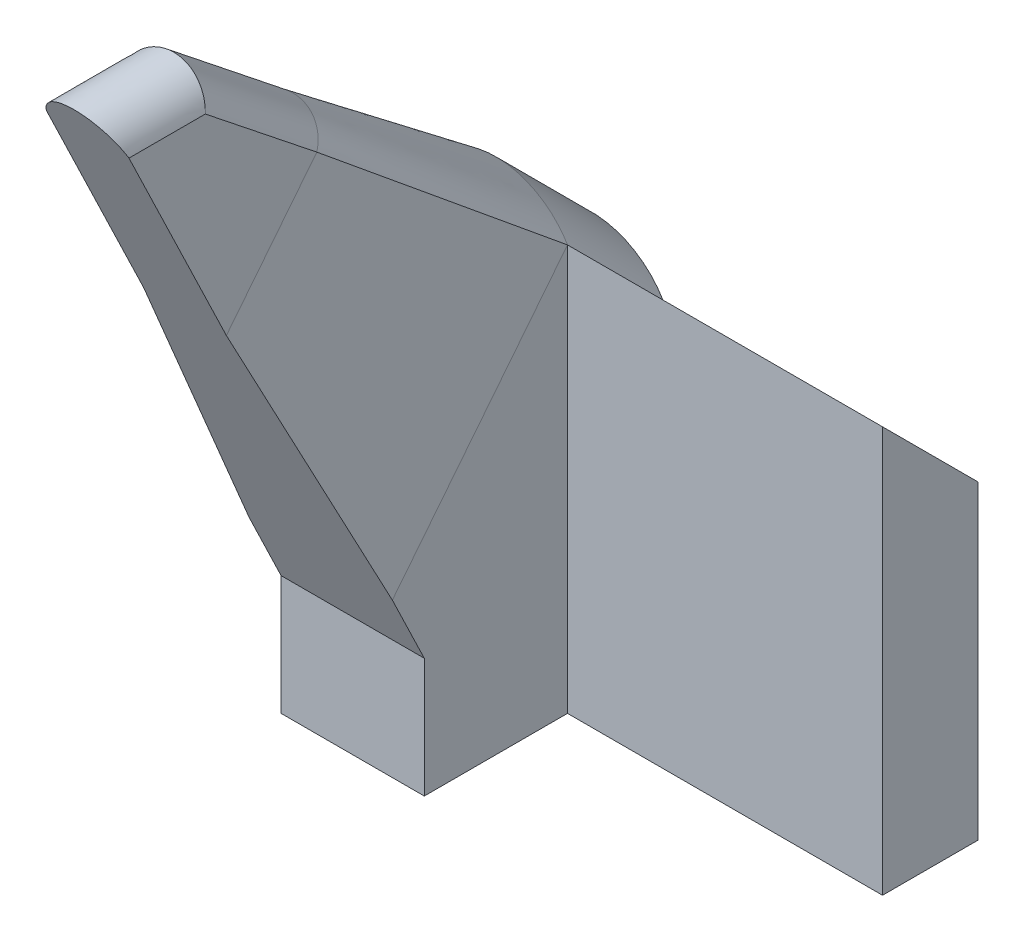
ISO-10303-21;
HEADER;
FILE_DESCRIPTION(('STEP AP214'),'2;1');
FILE_NAME('part.step','',(''),(''),'','','');
FILE_SCHEMA(('AUTOMOTIVE_DESIGN { 1 0 10303 214 1 1 1 1 }'));
ENDSEC;
DATA;
#1=APPLICATION_CONTEXT('core data for automotive mechanical design processes');
#2=APPLICATION_PROTOCOL_DEFINITION('international standard','automotive_design',2000,#1);
#3=PRODUCT_CONTEXT('',#1,'mechanical');
#4=PRODUCT('Part','Part','',(#3));
#5=PRODUCT_RELATED_PRODUCT_CATEGORY('part','',(#4));
#6=PRODUCT_DEFINITION_FORMATION('','',#4);
#7=PRODUCT_DEFINITION_CONTEXT('part definition',#1,'design');
#8=PRODUCT_DEFINITION('design','',#6,#7);
#9=PRODUCT_DEFINITION_SHAPE('','',#8);
#10=(LENGTH_UNIT() NAMED_UNIT(*) SI_UNIT(.MILLI.,.METRE.));
#11=(NAMED_UNIT(*) PLANE_ANGLE_UNIT() SI_UNIT($,.RADIAN.));
#12=(NAMED_UNIT(*) SI_UNIT($,.STERADIAN.) SOLID_ANGLE_UNIT());
#13=UNCERTAINTY_MEASURE_WITH_UNIT(LENGTH_MEASURE(1.E-05),#10,'distance_accuracy_value','');
#14=(GEOMETRIC_REPRESENTATION_CONTEXT(3) GLOBAL_UNCERTAINTY_ASSIGNED_CONTEXT((#13)) GLOBAL_UNIT_ASSIGNED_CONTEXT((#10,
#11,#12)) REPRESENTATION_CONTEXT('',''));
#15=CARTESIAN_POINT('',(0.,0.,0.));
#16=DIRECTION('',(0.,0.,1.));
#17=DIRECTION('',(1.,0.,0.));
#18=AXIS2_PLACEMENT_3D('',#15,#16,#17);
#19=CARTESIAN_POINT('',(9.6,0.751999000000001,0.));
#20=DIRECTION('',(0.,-0.707106781186548,0.707106781186547));
#21=DIRECTION('',(0.,-0.707106781186547,-0.707106781186548));
#22=AXIS2_PLACEMENT_3D('',#19,#20,#21);
#23=PLANE('',#22);
#24=DIRECTION('',(0.,-0.707106781186547,-0.707106781186548));
#25=VECTOR('',#24,1.);
#26=CARTESIAN_POINT('',(3.,2.751999,2.));
#27=LINE('',#26,#25);
#28=CARTESIAN_POINT('',(3.,2.751999,2.));
#29=VERTEX_POINT('',#28);
#30=CARTESIAN_POINT('',(3.,0.751999000000001,0.));
#31=VERTEX_POINT('',#30);
#32=EDGE_CURVE('E148',#29,#31,#27,.T.);
#33=ORIENTED_EDGE('',*,*,#32,.F.);
#34=DIRECTION('',(-1.,0.,0.));
#35=VECTOR('',#34,1.);
#36=CARTESIAN_POINT('',(9.6,2.751999,2.));
#37=LINE('',#36,#35);
#38=CARTESIAN_POINT('',(9.6,2.751999,2.));
#39=VERTEX_POINT('',#38);
#40=EDGE_CURVE('E166',#39,#29,#37,.T.);
#41=ORIENTED_EDGE('',*,*,#40,.F.);
#42=DIRECTION('',(0.,0.707106781186547,0.707106781186548));
#43=VECTOR('',#42,1.);
#44=CARTESIAN_POINT('',(9.6,0.751999000000001,0.));
#45=LINE('',#44,#43);
#46=CARTESIAN_POINT('',(9.6,0.751999000000001,0.));
#47=VERTEX_POINT('',#46);
#48=EDGE_CURVE('E254',#47,#39,#45,.T.);
#49=ORIENTED_EDGE('',*,*,#48,.F.);
#50=DIRECTION('',(-1.,0.,0.));
#51=VECTOR('',#50,1.);
#52=CARTESIAN_POINT('',(9.6,0.751999000000001,0.));
#53=LINE('',#52,#51);
#54=EDGE_CURVE('E169',#47,#31,#53,.T.);
#55=ORIENTED_EDGE('',*,*,#54,.T.);
#56=EDGE_LOOP('',(#33,#41,#49,#55));
#57=FACE_BOUND('',#56,.T.);
#58=ADVANCED_FACE('F36',(#57),#23,.F.);
#59=CARTESIAN_POINT('',(9.6,-3.248001,0.));
#60=DIRECTION('',(0.,0.,1.));
#61=DIRECTION('',(1.,0.,0.));
#62=AXIS2_PLACEMENT_3D('',#59,#60,#61);
#63=PLANE('',#62);
#64=DIRECTION('',(0.,1.,0.));
#65=VECTOR('',#64,1.);
#66=CARTESIAN_POINT('',(9.6,-3.248001,0.));
#67=LINE('',#66,#65);
#68=CARTESIAN_POINT('',(9.6,-5.748001,0.));
#69=VERTEX_POINT('',#68);
#70=EDGE_CURVE('E83',#69,#47,#67,.T.);
#71=ORIENTED_EDGE('',*,*,#70,.F.);
#72=DIRECTION('',(1.,0.,0.));
#73=VECTOR('',#72,1.);
#74=CARTESIAN_POINT('',(0.,-5.748001,0.));
#75=LINE('',#74,#73);
#76=CARTESIAN_POINT('',(0.,-5.748001,0.));
#77=VERTEX_POINT('',#76);
#78=EDGE_CURVE('E142',#77,#69,#75,.T.);
#79=ORIENTED_EDGE('',*,*,#78,.F.);
#80=DIRECTION('',(0.,1.,0.));
#81=VECTOR('',#80,1.);
#82=CARTESIAN_POINT('',(0.,-3.248001,0.));
#83=LINE('',#82,#81);
#84=CARTESIAN_POINT('',(0.,0.751999000000001,0.));
#85=VERTEX_POINT('',#84);
#86=EDGE_CURVE('E133',#77,#85,#83,.T.);
#87=ORIENTED_EDGE('',*,*,#86,.T.);
#88=CARTESIAN_POINT('',(1.5,-0.146530411764704,0.));
#89=DIRECTION('',(0.,0.,-1.));
#90=DIRECTION('',(1.,0.,0.));
#91=AXIS2_PLACEMENT_3D('',#88,#89,#90);
#92=CIRCLE('',#91,1.74852941176471);
#93=EDGE_CURVE('E141',#85,#31,#92,.T.);
#94=ORIENTED_EDGE('',*,*,#93,.T.);
#95=ORIENTED_EDGE('',*,*,#54,.F.);
#96=EDGE_LOOP('',(#71,#79,#87,#94,#95));
#97=FACE_BOUND('',#96,.T.);
#98=ADVANCED_FACE('F38',(#97),#63,.F.);
#99=CARTESIAN_POINT('',(9.6,2.751999,2.));
#100=DIRECTION('',(0.,0.,-1.));
#101=DIRECTION('',(0.,1.,0.));
#102=AXIS2_PLACEMENT_3D('',#99,#100,#101);
#103=PLANE('',#102);
#104=ORIENTED_EDGE('',*,*,#40,.T.);
#105=DIRECTION('',(0.,-1.,0.));
#106=VECTOR('',#105,1.);
#107=CARTESIAN_POINT('',(3.,2.751999,2.));
#108=LINE('',#107,#106);
#109=CARTESIAN_POINT('',(3.,-5.748001,2.));
#110=VERTEX_POINT('',#109);
#111=EDGE_CURVE('E143',#29,#110,#108,.T.);
#112=ORIENTED_EDGE('',*,*,#111,.T.);
#113=DIRECTION('',(-1.,0.,0.));
#114=VECTOR('',#113,1.);
#115=CARTESIAN_POINT('',(9.6,-5.748001,2.));
#116=LINE('',#115,#114);
#117=CARTESIAN_POINT('',(9.6,-5.748001,2.));
#118=VERTEX_POINT('',#117);
#119=EDGE_CURVE('E348',#118,#110,#116,.T.);
#120=ORIENTED_EDGE('',*,*,#119,.F.);
#121=DIRECTION('',(0.,-1.,0.));
#122=VECTOR('',#121,1.);
#123=CARTESIAN_POINT('',(9.6,2.751999,2.));
#124=LINE('',#123,#122);
#125=EDGE_CURVE('E170',#39,#118,#124,.T.);
#126=ORIENTED_EDGE('',*,*,#125,.F.);
#127=EDGE_LOOP('',(#104,#112,#120,#126));
#128=FACE_BOUND('',#127,.T.);
#129=ADVANCED_FACE('F317',(#128),#103,.F.);
#130=CARTESIAN_POINT('',(9.6,0.,0.));
#131=DIRECTION('',(-1.,0.,0.));
#132=DIRECTION('',(0.,0.,1.));
#133=AXIS2_PLACEMENT_3D('',#130,#131,#132);
#134=PLANE('',#133);
#135=ORIENTED_EDGE('',*,*,#70,.T.);
#136=ORIENTED_EDGE('',*,*,#48,.T.);
#137=ORIENTED_EDGE('',*,*,#125,.T.);
#138=DIRECTION('',(0.,0.,1.));
#139=VECTOR('',#138,1.);
#140=CARTESIAN_POINT('',(9.6,-5.748001,0.));
#141=LINE('',#140,#139);
#142=EDGE_CURVE('E352',#69,#118,#141,.T.);
#143=ORIENTED_EDGE('',*,*,#142,.F.);
#144=EDGE_LOOP('',(#135,#136,#137,#143));
#145=FACE_BOUND('',#144,.T.);
#146=ADVANCED_FACE('F314',(#145),#134,.F.);
#147=CARTESIAN_POINT('',(0.,0.,0.));
#148=DIRECTION('',(-1.,0.,0.));
#149=DIRECTION('',(0.,0.,1.));
#150=AXIS2_PLACEMENT_3D('',#147,#148,#149);
#151=PLANE('',#150);
#152=DIRECTION('',(0.,0.782438657573284,-0.622727666909795));
#153=VECTOR('',#152,1.);
#154=CARTESIAN_POINT('',(0.,-5.08829292882305,8.23993542940507));
#155=LINE('',#154,#153);
#156=CARTESIAN_POINT('',(0.,-1.85812330899022,5.66910643008125));
#157=VERTEX_POINT('',#156);
#158=CARTESIAN_POINT('',(0.,2.751999,2.));
#159=VERTEX_POINT('',#158);
#160=EDGE_CURVE('E136',#157,#159,#155,.T.);
#161=ORIENTED_EDGE('',*,*,#160,.T.);
#162=DIRECTION('',(0.,0.707106781186547,0.707106781186548));
#163=VECTOR('',#162,1.);
#164=CARTESIAN_POINT('',(0.,0.751999000000001,0.));
#165=LINE('',#164,#163);
#166=EDGE_CURVE('E129',#85,#159,#165,.T.);
#167=ORIENTED_EDGE('',*,*,#166,.F.);
#168=ORIENTED_EDGE('',*,*,#86,.F.);
#169=DIRECTION('',(0.,0.,-1.));
#170=VECTOR('',#169,1.);
#171=CARTESIAN_POINT('',(0.,-5.748001,5.));
#172=LINE('',#171,#170);
#173=CARTESIAN_POINT('',(0.,-5.748001,5.));
#174=VERTEX_POINT('',#173);
#175=EDGE_CURVE('E350',#174,#77,#172,.T.);
#176=ORIENTED_EDGE('',*,*,#175,.F.);
#177=DIRECTION('',(0.,1.,0.));
#178=VECTOR('',#177,1.);
#179=CARTESIAN_POINT('',(0.,-5.748001,5.));
#180=LINE('',#179,#178);
#181=CARTESIAN_POINT('',(0.,-3.248001,5.));
#182=VERTEX_POINT('',#181);
#183=EDGE_CURVE('E151',#174,#182,#180,.T.);
#184=ORIENTED_EDGE('',*,*,#183,.T.);
#185=DIRECTION('',(0.,-0.901025471872542,-0.433766180144167));
#186=VECTOR('',#185,1.);
#187=CARTESIAN_POINT('',(0.,8.28512503996854,10.5522071058453));
#188=LINE('',#187,#186);
#189=EDGE_CURVE('E249',#157,#182,#188,.T.);
#190=ORIENTED_EDGE('',*,*,#189,.F.);
#191=EDGE_LOOP('',(#161,#167,#168,#176,#184,#190));
#192=FACE_BOUND('',#191,.T.);
#193=ADVANCED_FACE('F131',(#192),#151,.T.);
#194=CARTESIAN_POINT('',(3.,0.,0.));
#195=DIRECTION('',(1.,0.,0.));
#196=DIRECTION('',(0.,0.,-1.));
#197=AXIS2_PLACEMENT_3D('',#194,#195,#196);
#198=PLANE('',#197);
#199=DIRECTION('',(0.,0.782438657573284,-0.622727666909795));
#200=VECTOR('',#199,1.);
#201=CARTESIAN_POINT('',(3.,-5.08829292882305,8.23993542940507));
#202=LINE('',#201,#200);
#203=CARTESIAN_POINT('',(3.,-1.85812330899022,5.66910643008125));
#204=VERTEX_POINT('',#203);
#205=EDGE_CURVE('E162',#204,#29,#202,.T.);
#206=ORIENTED_EDGE('',*,*,#205,.F.);
#207=DIRECTION('',(0.,-0.901025471872542,-0.433766180144167));
#208=VECTOR('',#207,1.);
#209=CARTESIAN_POINT('',(3.,8.28512503996854,10.5522071058453));
#210=LINE('',#209,#208);
#211=CARTESIAN_POINT('',(3.,-3.248001,5.));
#212=VERTEX_POINT('',#211);
#213=EDGE_CURVE('E241',#204,#212,#210,.T.);
#214=ORIENTED_EDGE('',*,*,#213,.T.);
#215=DIRECTION('',(0.,1.,0.));
#216=VECTOR('',#215,1.);
#217=CARTESIAN_POINT('',(3.,-5.748001,5.));
#218=LINE('',#217,#216);
#219=CARTESIAN_POINT('',(3.,-5.748001,5.));
#220=VERTEX_POINT('',#219);
#221=EDGE_CURVE('E149',#220,#212,#218,.T.);
#222=ORIENTED_EDGE('',*,*,#221,.F.);
#223=DIRECTION('',(0.,0.,1.));
#224=VECTOR('',#223,1.);
#225=CARTESIAN_POINT('',(3.,-5.748001,2.));
#226=LINE('',#225,#224);
#227=EDGE_CURVE('E341',#110,#220,#226,.T.);
#228=ORIENTED_EDGE('',*,*,#227,.F.);
#229=ORIENTED_EDGE('',*,*,#111,.F.);
#230=EDGE_LOOP('',(#206,#214,#222,#228,#229));
#231=FACE_BOUND('',#230,.T.);
#232=ADVANCED_FACE('F306',(#231),#198,.T.);
#233=CARTESIAN_POINT('',(3.,8.28512503996854,10.5522071058453));
#234=DIRECTION('',(0.,0.433766180144167,-0.901025471872542));
#235=DIRECTION('',(0.,0.901025471872542,0.433766180144167));
#236=AXIS2_PLACEMENT_3D('',#233,#234,#235);
#237=PLANE('',#236);
#238=DIRECTION('',(-0.0964650427133269,0.896823425207423,0.431743256500368));
#239=VECTOR('',#238,1.);
#240=CARTESIAN_POINT('',(1.91911416293691,8.19073699716077,10.5067673907006));
#241=LINE('',#240,#239);
#242=CARTESIAN_POINT('',(2.365,4.0453921924655,8.51114081027085));
#243=VERTEX_POINT('',#242);
#244=EDGE_CURVE('E51',#204,#243,#241,.T.);
#245=ORIENTED_EDGE('',*,*,#244,.T.);
#246=DIRECTION('',(0.,0.901025471872542,0.433766180144167));
#247=VECTOR('',#246,1.);
#248=CARTESIAN_POINT('',(2.365,8.28512503996854,10.5522071058453));
#249=LINE('',#248,#247);
#250=CARTESIAN_POINT('',(2.365,8.28512503996854,10.5522071058453));
#251=VERTEX_POINT('',#250);
#252=EDGE_CURVE('E12',#243,#251,#249,.T.);
#253=ORIENTED_EDGE('',*,*,#252,.T.);
#254=CARTESIAN_POINT('',(1.5,8.05986867200041,10.4437655608093));
#255=DIRECTION('',(0.,-0.433766180144167,0.901025471872542));
#256=DIRECTION('',(0.,-0.901025471872543,-0.433766180144167));
#257=AXIS2_PLACEMENT_3D('',#254,#255,#256);
#258=CIRCLE('',#257,0.900402687690347);
#259=CARTESIAN_POINT('',(0.635,8.28512503996854,10.5522071058453));
#260=VERTEX_POINT('',#259);
#261=EDGE_CURVE('E330',#251,#260,#258,.T.);
#262=ORIENTED_EDGE('',*,*,#261,.T.);
#263=DIRECTION('',(0.,-0.901025471872542,-0.433766180144167));
#264=VECTOR('',#263,1.);
#265=CARTESIAN_POINT('',(0.635,8.28512503996854,10.5522071058453));
#266=LINE('',#265,#264);
#267=CARTESIAN_POINT('',(0.635,4.0453921924655,8.51114081027085));
#268=VERTEX_POINT('',#267);
#269=EDGE_CURVE('E260',#260,#268,#266,.T.);
#270=ORIENTED_EDGE('',*,*,#269,.T.);
#271=DIRECTION('',(-0.0964650427133272,-0.896823425207423,-0.431743256500368));
#272=VECTOR('',#271,1.);
#273=CARTESIAN_POINT('',(1.10880235046014,8.45027332721761,10.6317117857391));
#274=LINE('',#273,#272);
#275=EDGE_CURVE('E497',#268,#157,#274,.T.);
#276=ORIENTED_EDGE('',*,*,#275,.T.);
#277=ORIENTED_EDGE('',*,*,#189,.T.);
#278=DIRECTION('',(-1.,0.,0.));
#279=VECTOR('',#278,1.);
#280=CARTESIAN_POINT('',(3.,-3.248001,5.));
#281=LINE('',#280,#279);
#282=EDGE_CURVE('E173',#212,#182,#281,.T.);
#283=ORIENTED_EDGE('',*,*,#282,.F.);
#284=ORIENTED_EDGE('',*,*,#213,.F.);
#285=EDGE_LOOP('',(#245,#253,#262,#270,#276,#277,#283,#284));
#286=FACE_BOUND('',#285,.T.);
#287=ADVANCED_FACE('F309',(#286),#237,.F.);
#288=CARTESIAN_POINT('',(0.,-5.08829292882305,8.23993542940507));
#289=DIRECTION('',(0.99425803821669,-0.0666375445190796,-0.0837280783367559));
#290=DIRECTION('',(-0.0839145996374482,0.,-0.99647294994279));
#291=AXIS2_PLACEMENT_3D('',#288,#289,#290);
#292=PLANE('',#291);
#293=DIRECTION('',(0.,0.782438657573284,-0.622727666909795));
#294=VECTOR('',#293,1.);
#295=CARTESIAN_POINT('',(0.635,-1.41419969405525,12.8563235090874));
#296=LINE('',#295,#294);
#297=CARTESIAN_POINT('',(0.63500000000041,6.42609223476927,6.6163880796812));
#298=VERTEX_POINT('',#297);
#299=EDGE_CURVE('E160',#268,#298,#296,.T.);
#300=ORIENTED_EDGE('',*,*,#299,.T.);
#301=DIRECTION('',(-0.107009127841966,-0.61915198844499,-0.777945924703714));
#302=VECTOR('',#301,1.);
#303=CARTESIAN_POINT('',(0.,2.751999,2.));
#304=LINE('',#303,#302);
#305=EDGE_CURVE('E283',#298,#159,#304,.T.);
#306=ORIENTED_EDGE('',*,*,#305,.T.);
#307=ORIENTED_EDGE('',*,*,#160,.F.);
#308=ORIENTED_EDGE('',*,*,#275,.F.);
#309=EDGE_LOOP('',(#300,#306,#307,#308));
#310=FACE_BOUND('',#309,.T.);
#311=ADVANCED_FACE('F304',(#310),#292,.F.);
#312=CARTESIAN_POINT('',(0.635,-1.41419969405525,12.8563235090874));
#313=DIRECTION('',(1.,0.,0.));
#314=DIRECTION('',(0.,0.,-1.));
#315=AXIS2_PLACEMENT_3D('',#312,#313,#314);
#316=PLANE('',#315);
#317=CARTESIAN_POINT('',(0.63500000000041,6.42609223476927,6.6163880796812));
#318=DIRECTION('',(0.,0.622727666909795,0.782438657573284));
#319=VECTOR('',#318,1.);
#320=LINE('',#317,#319);
#321=CARTESIAN_POINT('',(0.635,8.28512503996854,8.95220710584534));
#322=VERTEX_POINT('',#321);
#323=EDGE_CURVE('E228',#322,#298,#320,.F.);
#324=ORIENTED_EDGE('',*,*,#323,.T.);
#325=ORIENTED_EDGE('',*,*,#299,.F.);
#326=ORIENTED_EDGE('',*,*,#269,.F.);
#327=DIRECTION('',(0.,0.,1.));
#328=VECTOR('',#327,1.);
#329=CARTESIAN_POINT('',(0.635,8.28512503996854,8.95220710584534));
#330=LINE('',#329,#328);
#331=EDGE_CURVE('E159',#322,#260,#330,.T.);
#332=ORIENTED_EDGE('',*,*,#331,.F.);
#333=EDGE_LOOP('',(#324,#325,#326,#332));
#334=FACE_BOUND('',#333,.T.);
#335=ADVANCED_FACE('F294',(#334),#316,.F.);
#336=CARTESIAN_POINT('',(2.365,-1.41419969405525,12.8563235090874));
#337=DIRECTION('',(-1.,0.,0.));
#338=DIRECTION('',(0.,0.,1.));
#339=AXIS2_PLACEMENT_3D('',#336,#337,#338);
#340=PLANE('',#339);
#341=ORIENTED_EDGE('',*,*,#252,.F.);
#342=DIRECTION('',(0.,0.782438657573284,-0.622727666909795));
#343=VECTOR('',#342,1.);
#344=CARTESIAN_POINT('',(2.365,-1.41419969405525,12.8563235090874));
#345=LINE('',#344,#343);
#346=CARTESIAN_POINT('',(2.365,6.4260922347678,6.61638807968238));
#347=VERTEX_POINT('',#346);
#348=EDGE_CURVE('E60',#243,#347,#345,.T.);
#349=ORIENTED_EDGE('',*,*,#348,.T.);
#350=CARTESIAN_POINT('',(2.365,8.28512503996855,8.95220710584534));
#351=DIRECTION('',(0.,-0.622727666909795,-0.782438657573285));
#352=VECTOR('',#351,1.);
#353=LINE('',#350,#352);
#354=CARTESIAN_POINT('',(2.365,8.28512503996855,8.95220710584534));
#355=VERTEX_POINT('',#354);
#356=EDGE_CURVE('E165',#347,#355,#353,.F.);
#357=ORIENTED_EDGE('',*,*,#356,.T.);
#358=DIRECTION('',(0.,0.,-1.));
#359=VECTOR('',#358,1.);
#360=CARTESIAN_POINT('',(2.365,8.28512503996854,8.95220710584534));
#361=LINE('',#360,#359);
#362=EDGE_CURVE('E280',#251,#355,#361,.T.);
#363=ORIENTED_EDGE('',*,*,#362,.F.);
#364=EDGE_LOOP('',(#341,#349,#357,#363));
#365=FACE_BOUND('',#364,.T.);
#366=ADVANCED_FACE('F197',(#365),#340,.F.);
#367=CARTESIAN_POINT('',(3.,-5.08829292882305,8.23993542940507));
#368=DIRECTION('',(-0.99425803821669,-0.0666375445190794,-0.0837280783367556));
#369=DIRECTION('',(-0.0839145996374479,0.,0.99647294994279));
#370=AXIS2_PLACEMENT_3D('',#367,#368,#369);
#371=PLANE('',#370);
#372=ORIENTED_EDGE('',*,*,#205,.T.);
#373=DIRECTION('',(-0.107009127841966,0.61915198844499,0.777945924703714));
#374=VECTOR('',#373,1.);
#375=CARTESIAN_POINT('',(3.,2.751999,2.));
#376=LINE('',#375,#374);
#377=EDGE_CURVE('E275',#29,#347,#376,.T.);
#378=ORIENTED_EDGE('',*,*,#377,.T.);
#379=ORIENTED_EDGE('',*,*,#348,.F.);
#380=ORIENTED_EDGE('',*,*,#244,.F.);
#381=EDGE_LOOP('',(#372,#378,#379,#380));
#382=FACE_BOUND('',#381,.T.);
#383=ADVANCED_FACE('F194',(#382),#371,.F.);
#384=CARTESIAN_POINT('',(2.365,8.28512503996855,8.95220710584534));
#385=CARTESIAN_POINT('',(2.33732983668171,8.37138810595242,8.92206952013243));
#386=CARTESIAN_POINT('',(2.29510697953605,8.45076134602559,8.89433902158437));
#387=CARTESIAN_POINT('',(2.18265760488102,8.59624977600904,8.84350996770304));
#388=CARTESIAN_POINT('',(2.11393041092185,8.65972218966301,8.82133471477081));
#389=CARTESIAN_POINT('',(1.88019477017387,8.81575688008088,8.76682113119919));
#390=CARTESIAN_POINT('',(1.69196689009115,8.87090274982435,8.74755490924022));
#391=CARTESIAN_POINT('',(1.31066240341703,8.87140437778706,8.74737965630259));
#392=CARTESIAN_POINT('',(1.12033634917385,8.81584289575955,8.76679108004278));
#393=CARTESIAN_POINT('',(0.809414816405939,8.60881683477738,8.83911943501712));
#394=CARTESIAN_POINT('',(0.690324140882369,8.45760071206739,8.89194956350008));
#395=CARTESIAN_POINT('',(0.63500000000041,8.28512503996983,8.95220710584392));
#396=B_SPLINE_CURVE_WITH_KNOTS('',3,(#384,#385,#386,#387,#388,#389,#390,#391,#392,#393,#394,
#395),.UNSPECIFIED.,.F.,.F.,(4,2,2,2,2,4),(0.,0.125,0.25,0.5,0.75,1.),.UNSPECIFIED.);
#397=DIRECTION('',(0.,-0.622727666909795,-0.782438657573284));
#398=VECTOR('',#397,1.);
#399=SURFACE_OF_LINEAR_EXTRUSION('',#396,#398);
#400=CARTESIAN_POINT('',(0.63500000000041,6.42609223476927,6.6163880796812));
#401=CARTESIAN_POINT('',(0.662227561770225,6.49250815870642,6.5635289411932));
#402=CARTESIAN_POINT('',(0.705694664140869,6.55576690397358,6.51318253962886));
#403=CARTESIAN_POINT('',(0.81418609301103,6.66619202872403,6.42529733656726));
#404=CARTESIAN_POINT('',(0.880488368416668,6.71499990656488,6.38645209854289));
#405=CARTESIAN_POINT('',(0.959708329543941,6.75766978855358,6.35249197169978));
#406=CARTESIAN_POINT('',(0.965799518668223,6.76086219458197,6.34995119800634));
#407=CARTESIAN_POINT('',(1.04607391046133,6.80180435138769,6.31736613393887));
#408=CARTESIAN_POINT('',(1.12810654344921,6.83116946604878,6.29399501191605));
#409=CARTESIAN_POINT('',(1.2167759502043,6.85221718630763,6.27724354187594));
#410=CARTESIAN_POINT('',(1.22096958207038,6.85318844214584,6.27647053829764));
#411=CARTESIAN_POINT('',(1.31428189218312,6.87426556368744,6.25969566834991));
#412=CARTESIAN_POINT('',(1.40791650448778,6.88462679308849,6.25144936795335));
#413=CARTESIAN_POINT('',(1.50800800114539,6.88461953444982,6.2514551449621));
#414=CARTESIAN_POINT('',(1.51540115752687,6.88455293305007,6.25150815171716));
#415=CARTESIAN_POINT('',(1.60790821528478,6.88288713541717,6.25283392756353));
#416=CARTESIAN_POINT('',(1.69366775858548,6.8726224130791,6.26100341987071));
#417=CARTESIAN_POINT('',(1.80060827973334,6.84842421763286,6.28026229166635));
#418=CARTESIAN_POINT('',(1.82511222404076,6.84204290580852,6.28534105328659));
#419=CARTESIAN_POINT('',(1.91150395011144,6.8164288632444,6.30572677018809));
#420=CARTESIAN_POINT('',(1.9719458664014,6.79251074145686,6.32476273682069));
#421=CARTESIAN_POINT('',(2.06521641270566,6.74494115843056,6.36262244015604));
#422=CARTESIAN_POINT('',(2.10042187264984,6.7239929922279,6.37929467706453));
#423=CARTESIAN_POINT('',(2.20956998590824,6.64788783540526,6.43986528702768));
#424=CARTESIAN_POINT('',(2.27496625791633,6.58259118296266,6.49183361916341));
#425=CARTESIAN_POINT('',(2.3382528437384,6.48364857513234,6.57058011096284));
#426=CARTESIAN_POINT('',(2.35307286274876,6.45518598349081,6.59323293251706));
#427=CARTESIAN_POINT('',(2.365,6.4260922347678,6.61638807968238));
#428=B_SPLINE_CURVE_WITH_KNOTS('',3,(#400,#401,#402,#403,#404,#405,#406,#407,#408,#409,#410,
#411,#412,#413,#414,#415,#416,#417,#418,#419,#420,#421,#422,#423,#424,#425,#426,#427),
.UNSPECIFIED.,.F.,.F.,(4,2,2,2,2,2,2,2,2,2,2,2,2,4),(0.,0.120359669059444,0.240125987332245,
0.25,0.369103116636821,0.375,0.5,0.509978118067455,0.625,0.659798237014814,0.75,
0.809369950998852,0.947958885040744,1.),.UNSPECIFIED.);
#429=EDGE_CURVE('E178',#298,#347,#428,.T.);
#430=ORIENTED_EDGE('',*,*,#429,.F.);
#431=ORIENTED_EDGE('',*,*,#323,.F.);
#432=CARTESIAN_POINT('',(2.365,8.28512503996855,8.95220710584534));
#433=CARTESIAN_POINT('',(2.3624903251996,8.29294929266722,8.94947362240425));
#434=CARTESIAN_POINT('',(2.35985051109621,8.30073710987375,8.94675557010179));
#435=CARTESIAN_POINT('',(2.35435999743409,8.31610371660395,8.94139553814979));
#436=CARTESIAN_POINT('',(2.35151351159694,8.32368383234887,8.93875304400319));
#437=CARTESIAN_POINT('',(2.34562532886082,8.33863230140841,8.93354277446132));
#438=CARTESIAN_POINT('',(2.34258769398414,8.34600207597003,8.93097448860981));
#439=CARTESIAN_POINT('',(2.33633286564566,8.36052756240018,8.92591183265191));
#440=CARTESIAN_POINT('',(2.33311958588647,8.36768478559716,8.92341694743078));
#441=CARTESIAN_POINT('',(2.32331858938807,8.38865013301443,8.91610592129433));
#442=CARTESIAN_POINT('',(2.31642035874359,8.40232939348078,8.91133198269162));
#443=CARTESIAN_POINT('',(2.30206888946534,8.42881471812959,8.90207765700571));
#444=CARTESIAN_POINT('',(2.29464382245303,8.44163456196729,8.89759285564528));
#445=CARTESIAN_POINT('',(2.2793501171333,8.46640657713553,8.88891861396302));
#446=CARTESIAN_POINT('',(2.27150781281548,8.47837332107367,8.88472437629142));
#447=CARTESIAN_POINT('',(2.25548493936133,8.50145099888135,8.87663994598755));
#448=CARTESIAN_POINT('',(2.24732901399996,8.51257714398824,8.87274426445632));
#449=CARTESIAN_POINT('',(2.22915284102723,8.53609358067735,8.86452464996629));
#450=CARTESIAN_POINT('',(2.21903756572355,8.54841925783864,8.86022552376125));
#451=CARTESIAN_POINT('',(2.19823824647267,8.57232021554474,8.85188899336142));
#452=CARTESIAN_POINT('',(2.18756526125038,8.58390408702679,8.84784859288101));
#453=CARTESIAN_POINT('',(2.16572265296454,8.6063151823613,8.84002835095711));
#454=CARTESIAN_POINT('',(2.15456331766971,8.61715136355638,8.83624543735849));
#455=CARTESIAN_POINT('',(2.13181857591352,8.63806459021318,8.82893860362406));
#456=CARTESIAN_POINT('',(2.12024275330014,8.64815096013054,8.82541152396097));
#457=CARTESIAN_POINT('',(2.09673264631765,8.66756693025009,8.81861835807098));
#458=CARTESIAN_POINT('',(2.08480730467992,8.67690620002153,8.81534894996034));
#459=CARTESIAN_POINT('',(2.06066355052949,8.69483403047423,8.80907252311134));
#460=CARTESIAN_POINT('',(2.04845346859046,8.70343259302391,8.80606200995695));
#461=CARTESIAN_POINT('',(2.02280504594499,8.72055464577546,8.80008355718086));
#462=CARTESIAN_POINT('',(2.00933766751355,8.72903972965942,8.79713008417903));
#463=CARTESIAN_POINT('',(1.98198732250919,8.74528828336501,8.79148985764914));
#464=CARTESIAN_POINT('',(1.96810599843563,8.75305420466915,8.78880219571956));
#465=CARTESIAN_POINT('',(1.93997726142352,8.76785301403175,8.78368607458153));
#466=CARTESIAN_POINT('',(1.92573134946559,8.77488844495176,8.78125671545012));
#467=CARTESIAN_POINT('',(1.89692249992767,8.78821764344318,8.7766536220633));
#468=CARTESIAN_POINT('',(1.88236094509243,8.7945140828518,8.77447896698372));
#469=CARTESIAN_POINT('',(1.85296958494064,8.8063592367132,8.77038229948058));
#470=CARTESIAN_POINT('',(1.83814105418474,8.81191078414287,8.76845933057029));
#471=CARTESIAN_POINT('',(1.8082639955242,8.82226263478531,8.76486449179871));
#472=CARTESIAN_POINT('',(1.79321663446465,8.82706595690975,8.76319161404183));
#473=CARTESIAN_POINT('',(1.76294952332237,8.83592029451061,8.7600965761225));
#474=CARTESIAN_POINT('',(1.7477308250103,8.83997453166627,8.75867334368646));
#475=CARTESIAN_POINT('',(1.71716785839845,8.84733201684552,8.75607839536332));
#476=CARTESIAN_POINT('',(1.70182451371134,8.85063869766445,8.75490553122473));
#477=CARTESIAN_POINT('',(1.67105815571992,8.85650468176262,8.7528132359026));
#478=CARTESIAN_POINT('',(1.65563592086971,8.85906762861002,8.75189257048044));
#479=CARTESIAN_POINT('',(1.62475664192476,8.86345196075438,8.75030766021582));
#480=CARTESIAN_POINT('',(1.60930021191989,8.86527719130983,8.74964208670283));
#481=CARTESIAN_POINT('',(1.57839625020682,8.86819401732361,8.74857137277064));
#482=CARTESIAN_POINT('',(1.5629491483543,8.8692896419994,8.74816480256668));
#483=CARTESIAN_POINT('',(1.53210627476604,8.8707571946414,8.74761705739932));
#484=CARTESIAN_POINT('',(1.51671072972788,8.87113330960653,8.74747434713574));
#485=CARTESIAN_POINT('',(1.48587548807359,8.87117387467279,8.74746019864215));
#486=CARTESIAN_POINT('',(1.47043578844314,8.87083633070855,8.74758952050377));
#487=CARTESIAN_POINT('',(1.43950278570699,8.86944209037655,8.748111962918));
#488=CARTESIAN_POINT('',(1.42400969817507,8.86838119419285,8.74850662385367));
#489=CARTESIAN_POINT('',(1.39301224572514,8.86552990139409,8.74955492073321));
#490=CARTESIAN_POINT('',(1.37750830101912,8.86373546391105,8.75020999063564));
#491=CARTESIAN_POINT('',(1.34653279652005,8.85940871780211,8.75177526741542));
#492=CARTESIAN_POINT('',(1.33106184249529,8.85687255390144,8.75268680637888));
#493=CARTESIAN_POINT('',(1.3001971776494,8.8510560789222,8.75476219481263));
#494=CARTESIAN_POINT('',(1.28480423797163,8.84777211623707,8.7559272811099));
#495=CARTESIAN_POINT('',(1.25414154810848,8.84045597418787,8.75850800466231));
#496=CARTESIAN_POINT('',(1.23887271491816,8.8364203561749,8.75992479195762));
#497=CARTESIAN_POINT('',(1.20850514082131,8.8275991485544,8.76300826492071));
#498=CARTESIAN_POINT('',(1.19340744543194,8.82281033366717,8.76467602388683));
#499=CARTESIAN_POINT('',(1.16342986851427,8.81248339592049,8.7682619557423));
#500=CARTESIAN_POINT('',(1.14855114763677,8.80694225272921,8.77018113685233));
#501=CARTESIAN_POINT('',(1.11905990299966,8.79511383509091,8.77427157475296));
#502=CARTESIAN_POINT('',(1.10444864741298,8.78882372821422,8.77644378774125));
#503=CARTESIAN_POINT('',(1.07554123724095,8.77550317476763,8.78104337191626));
#504=CARTESIAN_POINT('',(1.06124645864996,8.76847005852482,8.78347166314619));
#505=CARTESIAN_POINT('',(1.03302117287895,8.75367193490823,8.78858705336349));
#506=CARTESIAN_POINT('',(1.01909215952172,8.74590438798081,8.79127505113391));
#507=CARTESIAN_POINT('',(0.991647957920817,8.72964873713347,8.79691743300555));
#508=CARTESIAN_POINT('',(0.978134404706359,8.72115818558208,8.79987272427373));
#509=CARTESIAN_POINT('',(0.952431859105605,8.70404427403938,8.80584828922837));
#510=CARTESIAN_POINT('',(0.940212509742203,8.69546116681113,8.80885339916327));
#511=CARTESIAN_POINT('',(0.916049756719534,8.67756473585915,8.81511882578905));
#512=CARTESIAN_POINT('',(0.904114638073778,8.66824143944924,8.81838262631484));
#513=CARTESIAN_POINT('',(0.880584376649444,8.64885793244006,8.82516441386629));
#514=CARTESIAN_POINT('',(0.868998128218514,8.63878808034961,8.82868571345453));
#515=CARTESIAN_POINT('',(0.846231777222552,8.61790841540027,8.83598081922621));
#516=CARTESIAN_POINT('',(0.835061206822458,8.60708930474633,8.83975777621365));
#517=CARTESIAN_POINT('',(0.813195206561367,8.58471287213971,8.84756594470173));
#518=CARTESIAN_POINT('',(0.802510009093761,8.57314661779152,8.85160022017548));
#519=CARTESIAN_POINT('',(0.781685169321466,8.54928139726782,8.8599242921102));
#520=CARTESIAN_POINT('',(0.771556526176785,8.53697386313253,8.8642170763271));
#521=CARTESIAN_POINT('',(0.753317098357099,8.51344337469091,8.8724416652338));
#522=CARTESIAN_POINT('',(0.745114010252916,8.50228336562532,8.87634929774462));
#523=CARTESIAN_POINT('',(0.728998404312692,8.47913183819252,8.88445984726681));
#524=CARTESIAN_POINT('',(0.72111076590694,8.46712492419693,8.88866832096407));
#525=CARTESIAN_POINT('',(0.705729062813687,8.44226624338021,8.89737313763714));
#526=CARTESIAN_POINT('',(0.698261590005255,8.42939972762507,8.90187433443564));
#527=CARTESIAN_POINT('',(0.683829152864867,8.40281463067845,8.91116353848205));
#528=CARTESIAN_POINT('',(0.676892643299692,8.38908210452052,8.91595601092184));
#529=CARTESIAN_POINT('',(0.66703871775638,8.36803321838087,8.92329602113759));
#530=CARTESIAN_POINT('',(0.663808276328758,8.36084694850827,8.92580097046551));
#531=CARTESIAN_POINT('',(0.657520604147849,8.34626177151009,8.93088429954542));
#532=CARTESIAN_POINT('',(0.654467328085875,8.33886133544679,8.93346320033912));
#533=CARTESIAN_POINT('',(0.648549515074506,8.32384997725515,8.93869525715035));
#534=CARTESIAN_POINT('',(0.645689083335261,8.3162376176094,8.94134892954461));
#535=CARTESIAN_POINT('',(0.640172502018947,8.30080499587046,8.94673189560728));
#536=CARTESIAN_POINT('',(0.637520611630487,8.29298339273458,8.94946170983148));
#537=CARTESIAN_POINT('',(0.635000000000411,8.28512503996983,8.95220710584392));
#538=B_SPLINE_CURVE_WITH_KNOTS('',3,(#432,#433,#434,#435,#436,#437,#438,#439,#440,#441,#442,
#443,#444,#445,#446,#447,#448,#449,#450,#451,#452,#453,#454,#455,#456,#457,#458,#459,#460,#461,
#462,#463,#464,#465,#466,#467,#468,#469,#470,#471,#472,#473,#474,#475,#476,#477,#478,#479,#480,
#481,#482,#483,#484,#485,#486,#487,#488,#489,#490,#491,#492,#493,#494,#495,#496,#497,#498,#499,
#500,#501,#502,#503,#504,#505,#506,#507,#508,#509,#510,#511,#512,#513,#514,#515,#516,#517,#518,
#519,#520,#521,#522,#523,#524,#525,#526,#527,#528,#529,#530,#531,#532,#533,#534,#535,#536,#537),
.UNSPECIFIED.,.F.,.F.,(4,2,2,2,2,2,2,2,2,2,2,2,2,2,2,2,2,2,2,2,2,2,2,2,2,2,2,2,2,2,2,2,2,2,2,2,
2,2,2,2,2,2,2,2,2,2,2,2,2,2,2,2,4),(0.,0.0259777091572329,0.0515254423209213,0.0766458120415095,
0.101340616950268,0.149452137065366,0.195866058263289,0.240574046075406,0.283560950811123,
0.33307589890449,0.381833906570872,0.429834651575556,0.477072914803743,0.523539640009498,
0.569222969255963,0.617766514650742,0.66613797369716,0.714334967697524,0.762351954986444,
0.810180808596398,0.857811385452289,0.905232084391889,0.952430391313208,0.999393410519706,
1.04610838188022,1.09256318375531,1.13874682177801,1.18505967402029,1.23164373657668,
1.27848795163402,1.32558011282815,1.37290735974357,1.4204566867006,1.46821546591759,
1.51617198500113,1.56431599838019,1.61263929174753,1.66113625779106,1.70980448047762,
1.75548077955854,1.80193770103071,1.84916340164017,1.89714882652026,1.94588874083911,
1.99538278571333,2.03853860389918,2.08342664949248,2.13003155370644,2.17834485407794,
2.20314462652183,2.22837267836052,2.25403083517006,2.28012174941809),.UNSPECIFIED.);
#539=EDGE_CURVE('E216',#355,#322,#538,.T.);
#540=ORIENTED_EDGE('',*,*,#539,.F.);
#541=ORIENTED_EDGE('',*,*,#356,.F.);
#542=EDGE_LOOP('',(#430,#431,#540,#541));
#543=FACE_BOUND('',#542,.T.);
#544=ADVANCED_FACE('F182',(#543),#399,.F.);
#545=CARTESIAN_POINT('',(1.5,8.05986867200041,6.75211239838224));
#546=DIRECTION('',(0.,-0.433766180144167,0.901025471872542));
#547=DIRECTION('',(0.,-0.901025471872543,-0.433766180144167));
#548=AXIS2_PLACEMENT_3D('',#545,#546,#547);
#549=CIRCLE('',#548,0.900402687690347);
#550=DIRECTION('',(0.,0.,1.));
#551=VECTOR('',#550,1.);
#552=SURFACE_OF_LINEAR_EXTRUSION('',#549,#551);
#553=ORIENTED_EDGE('',*,*,#362,.T.);
#554=ORIENTED_EDGE('',*,*,#539,.T.);
#555=ORIENTED_EDGE('',*,*,#331,.T.);
#556=ORIENTED_EDGE('',*,*,#261,.F.);
#557=EDGE_LOOP('',(#553,#554,#555,#556));
#558=FACE_BOUND('',#557,.T.);
#559=ADVANCED_FACE('F193',(#558),#552,.T.);
#560=CARTESIAN_POINT('',(1.5,1.8534695882353,2.));
#561=DIRECTION('',(0.,0.,-1.));
#562=DIRECTION('',(1.,0.,0.));
#563=AXIS2_PLACEMENT_3D('',#560,#561,#562);
#564=CIRCLE('',#563,1.74852941176471);
#565=DIRECTION('',(0.,-0.707106781186547,-0.707106781186548));
#566=VECTOR('',#565,1.);
#567=SURFACE_OF_LINEAR_EXTRUSION('',#564,#566);
#568=ORIENTED_EDGE('',*,*,#93,.F.);
#569=ORIENTED_EDGE('',*,*,#166,.T.);
#570=CARTESIAN_POINT('',(0.,2.751999,2.));
#571=CARTESIAN_POINT('',(0.0126389102238268,2.7730963703792,1.99999366469983));
#572=CARTESIAN_POINT('',(0.0257606651216679,2.79389828191787,1.99990477764122));
#573=CARTESIAN_POINT('',(0.0529083822627921,2.83489894790321,1.99965104020154));
#574=CARTESIAN_POINT('',(0.0669342082821723,2.85509779255098,1.99948620124186));
#575=CARTESIAN_POINT('',(0.110277452697142,2.91477514353403,1.99901141107668));
#576=CARTESIAN_POINT('',(0.140864235184146,2.9533404214359,1.99872113454319));
#577=CARTESIAN_POINT('',(0.205040061787238,3.02785724992175,1.99843472483558));
#578=CARTESIAN_POINT('',(0.2386282971587,3.0638094998826,1.9984385126628));
#579=CARTESIAN_POINT('',(0.308594049637999,3.13289060977902,1.99867278626876));
#580=CARTESIAN_POINT('',(0.34497157804948,3.16601945827158,1.99890327296625));
#581=CARTESIAN_POINT('',(0.420765872545942,3.22947664543034,1.99939501948457));
#582=CARTESIAN_POINT('',(0.460210749830156,3.25977160311189,1.9996565794051));
#583=CARTESIAN_POINT('',(0.521250582291831,3.30252219711794,1.99990813368572));
#584=CARTESIAN_POINT('',(0.541911574586593,3.31632507855789,1.99996851977921));
#585=CARTESIAN_POINT('',(0.5838373662789,3.34298131456072,2.00000926064162));
#586=CARTESIAN_POINT('',(0.605102163397991,3.35583467270597,1.99998961571251));
#587=CARTESIAN_POINT('',(0.669681829205319,3.39296603483398,1.99988831105011));
#588=CARTESIAN_POINT('',(0.713813448037182,3.41583728180529,1.99976431647099));
#589=CARTESIAN_POINT('',(0.803791167157783,3.45788701181349,1.99969948157271));
#590=CARTESIAN_POINT('',(0.849637293973527,3.47706543768651,1.99975864408853));
#591=CARTESIAN_POINT('',(0.942024635428741,3.51122068848489,1.99992101398846));
#592=CARTESIAN_POINT('',(0.988541982247642,3.52626148464472,2.00002348025007));
#593=CARTESIAN_POINT('',(1.08273078372692,3.55213657361393,1.9999541039955));
#594=CARTESIAN_POINT('',(1.13040231992546,3.56297056830557,1.99978224204328));
#595=CARTESIAN_POINT('',(1.22646960203965,3.58077612395625,1.99961248336976));
#596=CARTESIAN_POINT('',(1.27486550519498,3.587746833441,1.99961462498377));
#597=CARTESIAN_POINT('',(1.34774998037561,3.59525598301815,1.99972681837143));
#598=CARTESIAN_POINT('',(1.37209400360238,3.59726789717159,1.99978238308381));
#599=CARTESIAN_POINT('',(1.42084529732825,3.60027369464168,1.99989661829758));
#600=CARTESIAN_POINT('',(1.44525256361415,3.60126764411055,1.9999552885969));
#601=CARTESIAN_POINT('',(1.49421515572516,3.60216800385695,2.00000628771835));
#602=CARTESIAN_POINT('',(1.51877059107361,3.60206872776337,1.99999826971669));
#603=CARTESIAN_POINT('',(1.56785174260583,3.60078190488953,1.9999273474516));
#604=CARTESIAN_POINT('',(1.59237745643708,3.5995942769636,1.99986443909565));
#605=CARTESIAN_POINT('',(1.665847813073,3.59450545783505,1.99969797720197));
#606=CARTESIAN_POINT('',(1.71469766411383,3.58907849635884,1.9996166453648));
#607=CARTESIAN_POINT('',(1.78750962857341,3.57801717877611,1.99964268640969));
#608=CARTESIAN_POINT('',(1.81170642198085,3.57384249041988,1.99967605456736));
#609=CARTESIAN_POINT('',(1.85990196931283,3.56450548643151,1.99977083106595));
#610=CARTESIAN_POINT('',(1.88390079316903,3.55934353662573,1.99983222903217));
#611=CARTESIAN_POINT('',(1.93165559281821,3.54800020534299,1.99994177780251));
#612=CARTESIAN_POINT('',(1.95541158375325,3.54181888784652,1.99998992943754));
#613=CARTESIAN_POINT('',(2.00262096013639,3.52838928137237,2.000007730142));
#614=CARTESIAN_POINT('',(2.02607431822814,3.52114089666236,1.99997737216386));
#615=CARTESIAN_POINT('',(2.09560139705155,3.49801660429614,1.99986301101868));
#616=CARTESIAN_POINT('',(2.14119520382953,3.48067657349764,1.99975562296221));
#617=CARTESIAN_POINT('',(2.23084315644738,3.44238842459097,1.99970559797047));
#618=CARTESIAN_POINT('',(2.27489698226291,3.42143956182841,1.9997629950757));
#619=CARTESIAN_POINT('',(2.36115700750319,3.37593943336064,1.99992485142887));
#620=CARTESIAN_POINT('',(2.40336183414924,3.35138554806519,2.00002934501472));
#621=CARTESIAN_POINT('',(2.4854118858728,3.29863234655698,1.99992955783538));
#622=CARTESIAN_POINT('',(2.52525775507738,3.27043403223339,1.99972536176757));
#623=CARTESIAN_POINT('',(2.60248625006094,3.21075379158517,1.99925287242272));
#624=CARTESIAN_POINT('',(2.63986541057561,3.17926739990432,1.99898449132472));
#625=CARTESIAN_POINT('',(2.7119640210645,3.11335383217216,1.99858652723019));
#626=CARTESIAN_POINT('',(2.74668225942912,3.07892533139051,1.99845700711731));
#627=CARTESIAN_POINT('',(2.81319194269049,3.00748325818635,1.99847919653971));
#628=CARTESIAN_POINT('',(2.84498918217185,2.97047507168186,1.99863033608895));
#629=CARTESIAN_POINT('',(2.90544143575448,2.89400787083725,1.99915607245956));
#630=CARTESIAN_POINT('',(2.93409907769452,2.8545509500975,1.99953048068753));
#631=CARTESIAN_POINT('',(2.96770996542899,2.80375176022543,1.99984349078057));
#632=CARTESIAN_POINT('',(2.9743339848907,2.79349803617057,1.99989842361678));
#633=CARTESIAN_POINT('',(2.98734496915174,2.77285342131053,1.99997676743287));
#634=CARTESIAN_POINT('',(2.99373213149137,2.76246265507368,2.00000020528213));
#635=CARTESIAN_POINT('',(2.99999999999977,2.75199899999985,1.99999999999947));
#636=B_SPLINE_CURVE_WITH_KNOTS('',3,(#570,#571,#572,#573,#574,#575,#576,#577,#578,#579,#580,
#581,#582,#583,#584,#585,#586,#587,#588,#589,#590,#591,#592,#593,#594,#595,#596,#597,#598,#599,
#600,#601,#602,#603,#604,#605,#606,#607,#608,#609,#610,#611,#612,#613,#614,#615,#616,#617,#618,
#619,#620,#621,#622,#623,#624,#625,#626,#627,#628,#629,#630,#631,#632,#633,#634,#635),
.UNSPECIFIED.,.F.,.F.,(4,2,2,2,2,2,2,2,2,2,2,2,2,2,2,2,2,2,2,2,2,2,2,2,2,2,2,2,2,2,2,2,4),(0.,
0.0737647518254837,0.14751841476862,0.295004939154066,0.442451842286062,0.589899342980053,
0.738908659960487,0.813429160121935,0.887949379118106,1.0368751010187,1.18580312806402,
1.33227942750756,1.47876610519682,1.62528505595987,1.69854908734784,1.77180835738553,
1.84544886195147,1.9190948574754,2.06635097429286,2.13999915787696,2.21362010406679,
2.28723643120512,2.36085936688914,2.50701942366304,2.65320967563104,2.79950668740154,
2.94576356590201,3.09222171649934,3.23874616316924,3.38497336169432,3.53107721780681,
3.56769723008092,3.60428598076938),.UNSPECIFIED.);
#637=EDGE_CURVE('E40',#159,#29,#636,.T.);
#638=ORIENTED_EDGE('',*,*,#637,.T.);
#639=ORIENTED_EDGE('',*,*,#32,.T.);
#640=EDGE_LOOP('',(#568,#569,#638,#639));
#641=FACE_BOUND('',#640,.T.);
#642=ADVANCED_FACE('F146',(#641),#567,.T.);
#643=CARTESIAN_POINT('',(3.00635,2.71525806765232,1.95383611920318));
#644=CARTESIAN_POINT('',(3.,2.751999,2.));
#645=CARTESIAN_POINT('',(2.365,6.4260922347678,6.61638807968238));
#646=CARTESIAN_POINT('',(2.97945910110127,2.76005775811381,1.95406767067483));
#647=CARTESIAN_POINT('',(2.97325725715719,2.79664318608784,2.));
#648=CARTESIAN_POINT('',(2.35307286274876,6.45518598349081,6.59323293251706));
#649=CARTESIAN_POINT('',(2.94972765320175,2.80489961822367,1.95429419889037));
#650=CARTESIAN_POINT('',(2.94367344716746,2.84132287522276,2.));
#651=CARTESIAN_POINT('',(2.3382528437384,6.48364857513234,6.57058011096284));
#652=CARTESIAN_POINT('',(2.83037506187094,2.96748301858683,1.95508166380837));
#653=CARTESIAN_POINT('',(2.82487596480208,3.00327616872916,2.));
#654=CARTESIAN_POINT('',(2.27496625791633,6.58259118296266,6.49183361916341));
#655=CARTESIAN_POINT('',(2.72340393015291,3.0824018173852,1.95560134712973));
#656=CARTESIAN_POINT('',(2.71831646535841,3.11770365914778,2.));
#657=CARTESIAN_POINT('',(2.20956998590824,6.64788783540526,6.43986528702768));
#658=CARTESIAN_POINT('',(2.54146162355545,3.22824531372339,1.95620705322936));
#659=CARTESIAN_POINT('',(2.53709489334847,3.2628566768769,2.));
#660=CARTESIAN_POINT('',(2.10042187264984,6.7239929922279,6.37929467706453));
#661=CARTESIAN_POINT('',(2.48315508152359,3.26963020024375,1.95637377559844));
#662=CARTESIAN_POINT('',(2.47901707490163,3.30403921963174,2.));
#663=CARTESIAN_POINT('',(2.06521641270566,6.74494115843056,6.36262244015604));
#664=CARTESIAN_POINT('',(2.32679964415167,3.36606414240301,1.95675237263179));
#665=CARTESIAN_POINT('',(2.32328624041157,3.39998935625503,2.));
#666=CARTESIAN_POINT('',(1.9719458664014,6.79251074145686,6.32476273682069));
#667=CARTESIAN_POINT('',(2.22428182526423,3.41676271205269,1.95694273229812));
#668=CARTESIAN_POINT('',(2.22118501461915,3.45042277295558,2.));
#669=CARTESIAN_POINT('',(1.91150395011144,6.8164288632444,6.30572677018809));
#670=CARTESIAN_POINT('',(2.07397431561437,3.47318110141104,1.95714658946714));
#671=CARTESIAN_POINT('',(2.07151033450968,3.50653616878132,2.));
#672=CARTESIAN_POINT('',(1.82511222404076,6.84204290580852,6.28534105328659));
#673=CARTESIAN_POINT('',(2.03124757419884,3.48740035475837,1.95719737708334));
#674=CARTESIAN_POINT('',(2.0289640168279,3.52067781874723,2.));
#675=CARTESIAN_POINT('',(1.80060827973334,6.84842421763286,6.28026229166635));
#676=CARTESIAN_POINT('',(1.84405324080933,3.54159222253051,1.95738996580129));
#677=CARTESIAN_POINT('',(1.8425642756388,3.57457271946664,2.));
#678=CARTESIAN_POINT('',(1.69366775858548,6.8726224130791,6.26100341987071));
#679=CARTESIAN_POINT('',(1.69225754574698,3.56521052952782,1.95747166072437));
#680=CARTESIAN_POINT('',(1.69142240386122,3.59805881275445,2.));
#681=CARTESIAN_POINT('',(1.60790821528478,6.88288713541717,6.25283392756353));
#682=CARTESIAN_POINT('',(1.52647321498108,3.5690200528863,1.95748491848283));
#683=CARTESIAN_POINT('',(1.52636359064985,3.60184711110574,2.));
#684=CARTESIAN_POINT('',(1.51540115752687,6.88455293305007,6.25150815171716));
#685=CARTESIAN_POINT('',(1.51323394466191,3.56917279465551,1.95748544855038));
#686=CARTESIAN_POINT('',(1.51318220264689,3.601999,2.));
#687=CARTESIAN_POINT('',(1.50800800114539,6.88461953444982,6.2514551449621));
#688=CARTESIAN_POINT('',(1.33413055717734,3.56917272206912,1.95748550632047));
#689=CARTESIAN_POINT('',(1.33486111111111,3.601999,2.));
#690=CARTESIAN_POINT('',(1.40791650448778,6.88462679308849,6.25144936795335));
#691=CARTESIAN_POINT('',(1.16840575100337,3.54520112107525,1.9574030433165));
#692=CARTESIAN_POINT('',(1.16985006923287,3.57816215516052,2.));
#693=CARTESIAN_POINT('',(1.31428189218312,6.87426556368744,6.25969566834991));
#694=CARTESIAN_POINT('',(1.0048540451889,3.49785338460336,1.95723529461703));
#695=CARTESIAN_POINT('',(1.00699380297981,3.53107452378695,2.));
#696=CARTESIAN_POINT('',(1.22096958207038,6.85318844214584,6.27647053829764));
#697=CARTESIAN_POINT('',(0.997507665706336,3.49567350226486,1.95722756458124));
#698=CARTESIAN_POINT('',(0.999678638820177,3.52890660804746,2.));
#699=CARTESIAN_POINT('',(1.2167759502043,6.85221718630763,6.27724354187594));
#700=CARTESIAN_POINT('',(0.842253115708766,3.44848651910014,1.95706004988084));
#701=CARTESIAN_POINT('',(0.845083347666592,3.48197842946597,2.));
#702=CARTESIAN_POINT('',(1.12810654344921,6.83116946604878,6.29399501191605));
#703=CARTESIAN_POINT('',(0.703412537228119,3.38469680384607,1.95682633866061));
#704=CARTESIAN_POINT('',(0.706805224091814,3.41852955184153,2.));
#705=CARTESIAN_POINT('',(1.04607391046133,6.80180435138769,6.31736613393887));
#706=CARTESIAN_POINT('',(0.568584200936154,3.30154011136152,1.95650048801994));
#707=CARTESIAN_POINT('',(0.572517025864194,3.33579082505677,2.));
#708=CARTESIAN_POINT('',(0.965799518668223,6.76086219458197,6.34995119800634));
#709=CARTESIAN_POINT('',(0.558366094710645,3.29508800889314,1.956475080283));
#710=CARTESIAN_POINT('',(0.562339780204044,3.32937099681057,2.));
#711=CARTESIAN_POINT('',(0.959708329543941,6.75766978855358,6.35249197169978));
#712=CARTESIAN_POINT('',(0.425570564421796,3.20929267965937,1.95613547901457));
#713=CARTESIAN_POINT('',(0.430074701095013,3.24400265220299,2.));
#714=CARTESIAN_POINT('',(0.880488368416668,6.71499990656488,6.38645209854289));
#715=CARTESIAN_POINT('',(0.318173318285221,3.117907851156,1.95574702663433));
#716=CARTESIAN_POINT('',(0.323084335856764,3.15303937766657,2.));
#717=CARTESIAN_POINT('',(0.81418609301103,6.66619202872403,6.42529733656726));
#718=CARTESIAN_POINT('',(0.133228938579138,2.92272256242579,1.95486817460371));
#719=CARTESIAN_POINT('',(0.138896916059947,2.95869329848072,2.));
#720=CARTESIAN_POINT('',(0.705694664140869,6.55576690397358,6.51318253962886));
#721=CARTESIAN_POINT('',(0.0558463159493892,2.81887862755931,1.95436471058807));
#722=CARTESIAN_POINT('',(0.0618500906604866,2.85525119717463,2.));
#723=CARTESIAN_POINT('',(0.662227561770225,6.49250815870642,6.5635289411932));
#724=CARTESIAN_POINT('',(-0.00635000000000559,2.71525806765231,1.95383611920319));
#725=CARTESIAN_POINT('',(0.,2.751999,2.));
#726=CARTESIAN_POINT('',(0.63500000000041,6.42609223476927,6.6163880796812));
#727=B_SPLINE_SURFACE_WITH_KNOTS('',3,1,((#643,#644,#645),(#646,#647,#648),(#649,#650,#651),
(#652,#653,#654),(#655,#656,#657),(#658,#659,#660),(#661,#662,#663),(#664,#665,#666),(#667,#668,
#669),(#670,#671,#672),(#673,#674,#675),(#676,#677,#678),(#679,#680,#681),(#682,#683,#684),
(#685,#686,#687),(#688,#689,#690),(#691,#692,#693),(#694,#695,#696),(#697,#698,#699),(#700,#701,
#702),(#703,#704,#705),(#706,#707,#708),(#709,#710,#711),(#712,#713,#714),(#715,#716,#717),
(#718,#719,#720),(#721,#722,#723),(#724,#725,#726)),.UNSPECIFIED.,.F.,.F.,.F.,(4,2,2,2,2,2,2,2,
2,2,2,2,2,4),(2,1,2),(0.,0.0520411149592558,0.190630049001148,0.25,0.340201762985186,0.375,
0.490021881932545,0.5,0.625,0.630896883363179,0.75,0.759874012667755,0.879640330940556,1.),
(-0.01,0.,1.),.UNSPECIFIED.);
#728=ORIENTED_EDGE('',*,*,#637,.F.);
#729=ORIENTED_EDGE('',*,*,#305,.F.);
#730=ORIENTED_EDGE('',*,*,#429,.T.);
#731=ORIENTED_EDGE('',*,*,#377,.F.);
#732=EDGE_LOOP('',(#728,#729,#730,#731));
#733=FACE_BOUND('',#732,.T.);
#734=ADVANCED_FACE('F365',(#733),#727,.T.);
#735=CARTESIAN_POINT('',(3.,-5.748001,5.));
#736=DIRECTION('',(0.,0.,-1.));
#737=DIRECTION('',(0.,1.,0.));
#738=AXIS2_PLACEMENT_3D('',#735,#736,#737);
#739=PLANE('',#738);
#740=ORIENTED_EDGE('',*,*,#282,.T.);
#741=ORIENTED_EDGE('',*,*,#183,.F.);
#742=DIRECTION('',(-1.,0.,0.));
#743=VECTOR('',#742,1.);
#744=CARTESIAN_POINT('',(3.,-5.748001,5.));
#745=LINE('',#744,#743);
#746=EDGE_CURVE('E347',#220,#174,#745,.T.);
#747=ORIENTED_EDGE('',*,*,#746,.F.);
#748=ORIENTED_EDGE('',*,*,#221,.T.);
#749=EDGE_LOOP('',(#740,#741,#747,#748));
#750=FACE_BOUND('',#749,.T.);
#751=ADVANCED_FACE('F376',(#750),#739,.F.);
#752=CARTESIAN_POINT('',(0.,-5.748001,0.));
#753=DIRECTION('',(0.,-1.,0.));
#754=DIRECTION('',(0.,0.,-1.));
#755=AXIS2_PLACEMENT_3D('',#752,#753,#754);
#756=PLANE('',#755);
#757=ORIENTED_EDGE('',*,*,#142,.T.);
#758=ORIENTED_EDGE('',*,*,#119,.T.);
#759=ORIENTED_EDGE('',*,*,#227,.T.);
#760=ORIENTED_EDGE('',*,*,#746,.T.);
#761=ORIENTED_EDGE('',*,*,#175,.T.);
#762=ORIENTED_EDGE('',*,*,#78,.T.);
#763=EDGE_LOOP('',(#757,#758,#759,#760,#761,#762));
#764=FACE_BOUND('',#763,.T.);
#765=ADVANCED_FACE('F479',(#764),#756,.T.);
#766=CLOSED_SHELL('',(#58,#98,#129,#146,#193,#232,#287,#311,#335,#366,#383,#544,#559,#642,#734,
#751,#765));
#767=MANIFOLD_SOLID_BREP('B2',#766);
#768=ADVANCED_BREP_SHAPE_REPRESENTATION('',(#18,#767),#14);
#769=SHAPE_DEFINITION_REPRESENTATION(#9,#768);
ENDSEC;
END-ISO-10303-21;
